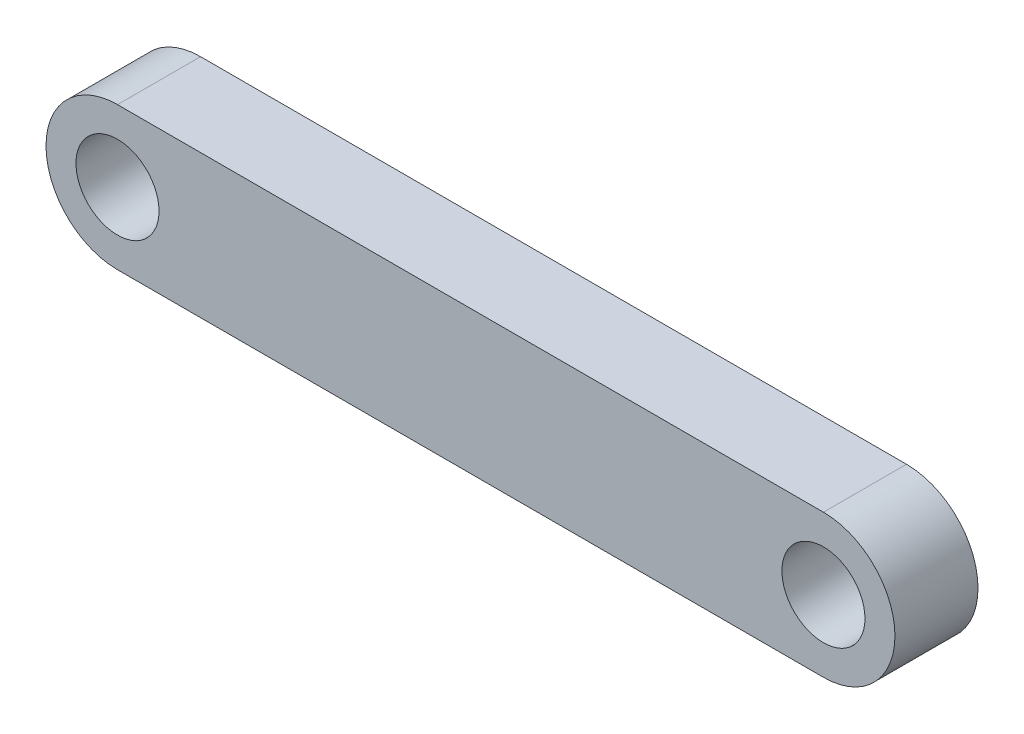
ISO-10303-21;
HEADER;
FILE_DESCRIPTION(('STEP AP214'),'2;1');
FILE_NAME('part.step','',(''),(''),'','','');
FILE_SCHEMA(('AUTOMOTIVE_DESIGN { 1 0 10303 214 1 1 1 1 }'));
ENDSEC;
DATA;
#1=APPLICATION_CONTEXT('core data for automotive mechanical design processes');
#2=APPLICATION_PROTOCOL_DEFINITION('international standard','automotive_design',2000,#1);
#3=PRODUCT_CONTEXT('',#1,'mechanical');
#4=PRODUCT('Part','Part','',(#3));
#5=PRODUCT_RELATED_PRODUCT_CATEGORY('part','',(#4));
#6=PRODUCT_DEFINITION_FORMATION('','',#4);
#7=PRODUCT_DEFINITION_CONTEXT('part definition',#1,'design');
#8=PRODUCT_DEFINITION('design','',#6,#7);
#9=PRODUCT_DEFINITION_SHAPE('','',#8);
#10=(LENGTH_UNIT() NAMED_UNIT(*) SI_UNIT(.MILLI.,.METRE.));
#11=(NAMED_UNIT(*) PLANE_ANGLE_UNIT() SI_UNIT($,.RADIAN.));
#12=(NAMED_UNIT(*) SI_UNIT($,.STERADIAN.) SOLID_ANGLE_UNIT());
#13=UNCERTAINTY_MEASURE_WITH_UNIT(LENGTH_MEASURE(1.E-05),#10,'distance_accuracy_value','');
#14=(GEOMETRIC_REPRESENTATION_CONTEXT(3) GLOBAL_UNCERTAINTY_ASSIGNED_CONTEXT((#13)) GLOBAL_UNIT_ASSIGNED_CONTEXT((#10,
#11,#12)) REPRESENTATION_CONTEXT('',''));
#15=CARTESIAN_POINT('',(0.,0.,0.));
#16=DIRECTION('',(0.,0.,1.));
#17=DIRECTION('',(1.,0.,0.));
#18=AXIS2_PLACEMENT_3D('',#15,#16,#17);
#19=CARTESIAN_POINT('',(-8.90996784565917,0.,2.));
#20=DIRECTION('',(0.,0.,1.));
#21=DIRECTION('',(1.,0.,0.));
#22=AXIS2_PLACEMENT_3D('',#19,#20,#21);
#23=PLANE('',#22);
#24=CARTESIAN_POINT('',(8.09003215434084,0.,2.));
#25=DIRECTION('',(0.,0.,1.));
#26=DIRECTION('',(1.,0.,0.));
#27=AXIS2_PLACEMENT_3D('',#24,#25,#26);
#28=CIRCLE('',#27,1.);
#29=CARTESIAN_POINT('',(9.09003215434084,0.,2.));
#30=VERTEX_POINT('',#29);
#31=EDGE_CURVE('E100',#30,#30,#28,.T.);
#32=ORIENTED_EDGE('',*,*,#31,.F.);
#33=EDGE_LOOP('',(#32));
#34=FACE_BOUND('',#33,.T.);
#35=CARTESIAN_POINT('',(-8.90996784565917,0.,2.));
#36=DIRECTION('',(0.,0.,1.));
#37=DIRECTION('',(1.,0.,0.));
#38=AXIS2_PLACEMENT_3D('',#35,#36,#37);
#39=CIRCLE('',#38,1.72186495176849);
#40=CARTESIAN_POINT('',(-8.90996784565917,1.72186495176849,2.));
#41=VERTEX_POINT('',#40);
#42=CARTESIAN_POINT('',(-8.90996784565917,-1.72186495176849,2.));
#43=VERTEX_POINT('',#42);
#44=EDGE_CURVE('E85',#41,#43,#39,.T.);
#45=ORIENTED_EDGE('',*,*,#44,.T.);
#46=DIRECTION('',(1.,0.,0.));
#47=VECTOR('',#46,1.);
#48=CARTESIAN_POINT('',(-8.90996784565917,-1.72186495176849,2.));
#49=LINE('',#48,#47);
#50=CARTESIAN_POINT('',(8.09003215434084,-1.72186495176849,2.));
#51=VERTEX_POINT('',#50);
#52=EDGE_CURVE('E80',#43,#51,#49,.T.);
#53=ORIENTED_EDGE('',*,*,#52,.T.);
#54=CARTESIAN_POINT('',(8.09003215434084,0.,2.));
#55=DIRECTION('',(0.,0.,1.));
#56=DIRECTION('',(1.,0.,0.));
#57=AXIS2_PLACEMENT_3D('',#54,#55,#56);
#58=CIRCLE('',#57,1.72186495176849);
#59=CARTESIAN_POINT('',(8.09003215434084,1.72186495176849,2.));
#60=VERTEX_POINT('',#59);
#61=EDGE_CURVE('E83',#51,#60,#58,.T.);
#62=ORIENTED_EDGE('',*,*,#61,.T.);
#63=DIRECTION('',(-1.,0.,0.));
#64=VECTOR('',#63,1.);
#65=CARTESIAN_POINT('',(-8.90996784565917,1.72186495176849,2.));
#66=LINE('',#65,#64);
#67=EDGE_CURVE('E50',#60,#41,#66,.T.);
#68=ORIENTED_EDGE('',*,*,#67,.T.);
#69=EDGE_LOOP('',(#45,#53,#62,#68));
#70=FACE_BOUND('',#69,.T.);
#71=CARTESIAN_POINT('',(-8.90996784565917,0.,2.));
#72=DIRECTION('',(0.,0.,1.));
#73=DIRECTION('',(1.,0.,0.));
#74=AXIS2_PLACEMENT_3D('',#71,#72,#73);
#75=CIRCLE('',#74,1.);
#76=CARTESIAN_POINT('',(-7.90996784565916,0.,2.));
#77=VERTEX_POINT('',#76);
#78=EDGE_CURVE('E115',#77,#77,#75,.T.);
#79=ORIENTED_EDGE('',*,*,#78,.F.);
#80=EDGE_LOOP('',(#79));
#81=FACE_BOUND('',#80,.T.);
#82=ADVANCED_FACE('F33',(#34,#70,#81),#23,.T.);
#83=CARTESIAN_POINT('',(-8.90996784565917,0.,0.));
#84=DIRECTION('',(0.,0.,1.));
#85=DIRECTION('',(1.,0.,0.));
#86=AXIS2_PLACEMENT_3D('',#83,#84,#85);
#87=PLANE('',#86);
#88=CARTESIAN_POINT('',(-8.90996784565917,0.,0.));
#89=DIRECTION('',(0.,0.,1.));
#90=DIRECTION('',(1.,0.,0.));
#91=AXIS2_PLACEMENT_3D('',#88,#89,#90);
#92=CIRCLE('',#91,1.72186495176849);
#93=CARTESIAN_POINT('',(-8.90996784565917,1.72186495176849,0.));
#94=VERTEX_POINT('',#93);
#95=CARTESIAN_POINT('',(-8.90996784565917,-1.72186495176849,0.));
#96=VERTEX_POINT('',#95);
#97=EDGE_CURVE('E97',#94,#96,#92,.T.);
#98=ORIENTED_EDGE('',*,*,#97,.F.);
#99=DIRECTION('',(-1.,0.,0.));
#100=VECTOR('',#99,1.);
#101=CARTESIAN_POINT('',(-8.90996784565917,1.72186495176849,0.));
#102=LINE('',#101,#100);
#103=CARTESIAN_POINT('',(8.09003215434084,1.72186495176849,0.));
#104=VERTEX_POINT('',#103);
#105=EDGE_CURVE('E73',#104,#94,#102,.T.);
#106=ORIENTED_EDGE('',*,*,#105,.F.);
#107=CARTESIAN_POINT('',(8.09003215434084,0.,0.));
#108=DIRECTION('',(0.,0.,1.));
#109=DIRECTION('',(1.,0.,0.));
#110=AXIS2_PLACEMENT_3D('',#107,#108,#109);
#111=CIRCLE('',#110,1.72186495176849);
#112=CARTESIAN_POINT('',(8.09003215434084,-1.72186495176849,0.));
#113=VERTEX_POINT('',#112);
#114=EDGE_CURVE('E67',#113,#104,#111,.T.);
#115=ORIENTED_EDGE('',*,*,#114,.F.);
#116=DIRECTION('',(1.,0.,0.));
#117=VECTOR('',#116,1.);
#118=CARTESIAN_POINT('',(-8.90996784565917,-1.72186495176849,0.));
#119=LINE('',#118,#117);
#120=EDGE_CURVE('E89',#96,#113,#119,.T.);
#121=ORIENTED_EDGE('',*,*,#120,.F.);
#122=EDGE_LOOP('',(#98,#106,#115,#121));
#123=FACE_BOUND('',#122,.T.);
#124=CARTESIAN_POINT('',(8.09003215434084,0.,0.));
#125=DIRECTION('',(0.,0.,1.));
#126=DIRECTION('',(1.,0.,0.));
#127=AXIS2_PLACEMENT_3D('',#124,#125,#126);
#128=CIRCLE('',#127,1.);
#129=CARTESIAN_POINT('',(9.09003215434084,0.,0.));
#130=VERTEX_POINT('',#129);
#131=EDGE_CURVE('E112',#130,#130,#128,.T.);
#132=ORIENTED_EDGE('',*,*,#131,.T.);
#133=EDGE_LOOP('',(#132));
#134=FACE_BOUND('',#133,.T.);
#135=CARTESIAN_POINT('',(-8.90996784565917,0.,0.));
#136=DIRECTION('',(0.,0.,1.));
#137=DIRECTION('',(1.,0.,0.));
#138=AXIS2_PLACEMENT_3D('',#135,#136,#137);
#139=CIRCLE('',#138,1.);
#140=CARTESIAN_POINT('',(-7.90996784565916,0.,0.));
#141=VERTEX_POINT('',#140);
#142=EDGE_CURVE('E118',#141,#141,#139,.T.);
#143=ORIENTED_EDGE('',*,*,#142,.T.);
#144=EDGE_LOOP('',(#143));
#145=FACE_BOUND('',#144,.T.);
#146=ADVANCED_FACE('F108',(#123,#134,#145),#87,.F.);
#147=CARTESIAN_POINT('',(-8.90996784565917,0.,2.));
#148=DIRECTION('',(0.,0.,-1.));
#149=DIRECTION('',(-1.,0.,0.));
#150=AXIS2_PLACEMENT_3D('',#147,#148,#149);
#151=CYLINDRICAL_SURFACE('',#150,1.72186495176849);
#152=ORIENTED_EDGE('',*,*,#97,.T.);
#153=DIRECTION('',(0.,0.,-1.));
#154=VECTOR('',#153,1.);
#155=CARTESIAN_POINT('',(-8.90996784565917,-1.72186495176849,2.));
#156=LINE('',#155,#154);
#157=EDGE_CURVE('E11',#43,#96,#156,.T.);
#158=ORIENTED_EDGE('',*,*,#157,.F.);
#159=ORIENTED_EDGE('',*,*,#44,.F.);
#160=DIRECTION('',(0.,0.,-1.));
#161=VECTOR('',#160,1.);
#162=CARTESIAN_POINT('',(-8.90996784565917,1.72186495176849,2.));
#163=LINE('',#162,#161);
#164=EDGE_CURVE('E93',#41,#94,#163,.T.);
#165=ORIENTED_EDGE('',*,*,#164,.T.);
#166=EDGE_LOOP('',(#152,#158,#159,#165));
#167=FACE_BOUND('',#166,.T.);
#168=ADVANCED_FACE('F35',(#167),#151,.T.);
#169=CARTESIAN_POINT('',(-8.90996784565917,-1.72186495176849,2.));
#170=DIRECTION('',(0.,1.,0.));
#171=DIRECTION('',(0.,0.,1.));
#172=AXIS2_PLACEMENT_3D('',#169,#170,#171);
#173=PLANE('',#172);
#174=ORIENTED_EDGE('',*,*,#120,.T.);
#175=DIRECTION('',(0.,0.,-1.));
#176=VECTOR('',#175,1.);
#177=CARTESIAN_POINT('',(8.09003215434084,-1.72186495176849,2.));
#178=LINE('',#177,#176);
#179=EDGE_CURVE('E42',#51,#113,#178,.T.);
#180=ORIENTED_EDGE('',*,*,#179,.F.);
#181=ORIENTED_EDGE('',*,*,#52,.F.);
#182=ORIENTED_EDGE('',*,*,#157,.T.);
#183=EDGE_LOOP('',(#174,#180,#181,#182));
#184=FACE_BOUND('',#183,.T.);
#185=ADVANCED_FACE('F88',(#184),#173,.F.);
#186=CARTESIAN_POINT('',(8.09003215434084,0.,2.));
#187=DIRECTION('',(0.,0.,-1.));
#188=DIRECTION('',(-1.,0.,0.));
#189=AXIS2_PLACEMENT_3D('',#186,#187,#188);
#190=CYLINDRICAL_SURFACE('',#189,1.72186495176849);
#191=ORIENTED_EDGE('',*,*,#114,.T.);
#192=DIRECTION('',(0.,0.,-1.));
#193=VECTOR('',#192,1.);
#194=CARTESIAN_POINT('',(8.09003215434084,1.72186495176849,2.));
#195=LINE('',#194,#193);
#196=EDGE_CURVE('E90',#60,#104,#195,.T.);
#197=ORIENTED_EDGE('',*,*,#196,.F.);
#198=ORIENTED_EDGE('',*,*,#61,.F.);
#199=ORIENTED_EDGE('',*,*,#179,.T.);
#200=EDGE_LOOP('',(#191,#197,#198,#199));
#201=FACE_BOUND('',#200,.T.);
#202=ADVANCED_FACE('F91',(#201),#190,.T.);
#203=CARTESIAN_POINT('',(-8.90996784565917,1.72186495176849,2.));
#204=DIRECTION('',(0.,-1.,0.));
#205=DIRECTION('',(0.,0.,-1.));
#206=AXIS2_PLACEMENT_3D('',#203,#204,#205);
#207=PLANE('',#206);
#208=ORIENTED_EDGE('',*,*,#105,.T.);
#209=ORIENTED_EDGE('',*,*,#164,.F.);
#210=ORIENTED_EDGE('',*,*,#67,.F.);
#211=ORIENTED_EDGE('',*,*,#196,.T.);
#212=EDGE_LOOP('',(#208,#209,#210,#211));
#213=FACE_BOUND('',#212,.T.);
#214=ADVANCED_FACE('F105',(#213),#207,.F.);
#215=CARTESIAN_POINT('',(8.09003215434084,0.,2.));
#216=DIRECTION('',(0.,0.,-1.));
#217=DIRECTION('',(-1.,0.,0.));
#218=AXIS2_PLACEMENT_3D('',#215,#216,#217);
#219=CYLINDRICAL_SURFACE('',#218,1.);
#220=ORIENTED_EDGE('',*,*,#31,.T.);
#221=EDGE_LOOP('',(#220));
#222=FACE_BOUND('',#221,.T.);
#223=ORIENTED_EDGE('',*,*,#131,.F.);
#224=EDGE_LOOP('',(#223));
#225=FACE_BOUND('',#224,.T.);
#226=ADVANCED_FACE('F135',(#222,#225),#219,.F.);
#227=CARTESIAN_POINT('',(-8.90996784565917,0.,2.));
#228=DIRECTION('',(0.,0.,-1.));
#229=DIRECTION('',(-1.,0.,0.));
#230=AXIS2_PLACEMENT_3D('',#227,#228,#229);
#231=CYLINDRICAL_SURFACE('',#230,1.);
#232=ORIENTED_EDGE('',*,*,#78,.T.);
#233=EDGE_LOOP('',(#232));
#234=FACE_BOUND('',#233,.T.);
#235=ORIENTED_EDGE('',*,*,#142,.F.);
#236=EDGE_LOOP('',(#235));
#237=FACE_BOUND('',#236,.T.);
#238=ADVANCED_FACE('F124',(#234,#237),#231,.F.);
#239=CLOSED_SHELL('',(#82,#146,#168,#185,#202,#214,#226,#238));
#240=MANIFOLD_SOLID_BREP('B2',#239);
#241=ADVANCED_BREP_SHAPE_REPRESENTATION('',(#18,#240),#14);
#242=SHAPE_DEFINITION_REPRESENTATION(#9,#241);
ENDSEC;
END-ISO-10303-21;
